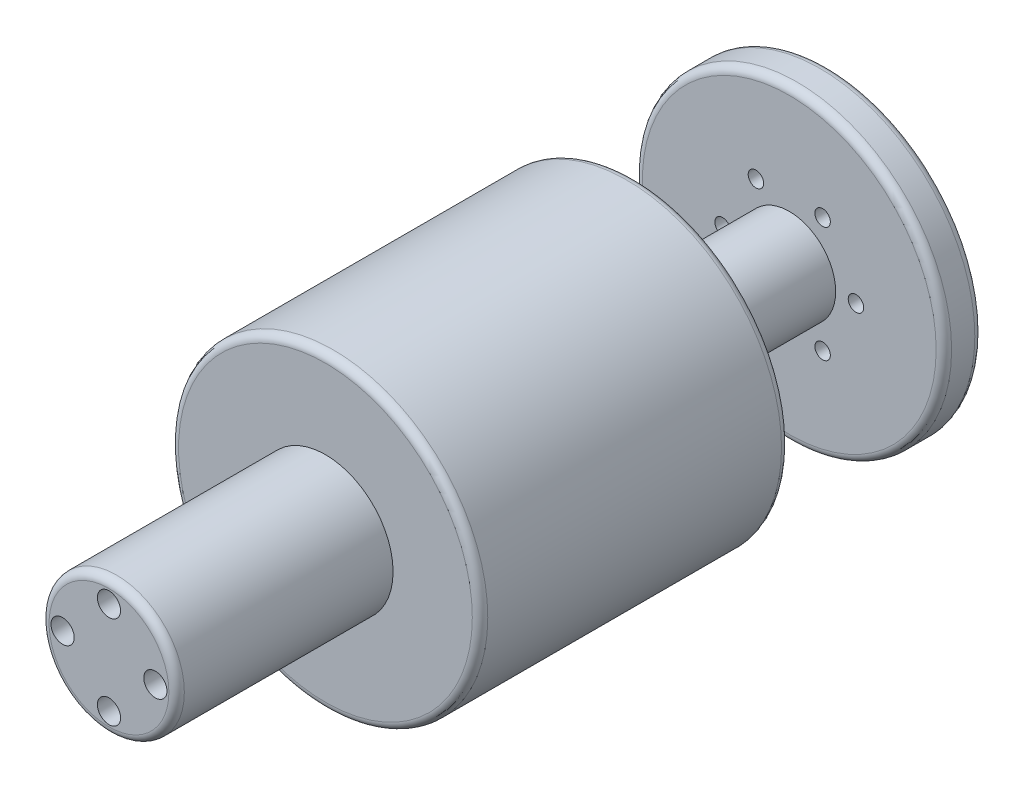
ISO-10303-21;
HEADER;
FILE_DESCRIPTION(('STEP AP214'),'2;1');
FILE_NAME('part.step','',(''),(''),'','','');
FILE_SCHEMA(('AUTOMOTIVE_DESIGN { 1 0 10303 214 1 1 1 1 }'));
ENDSEC;
DATA;
#1=APPLICATION_CONTEXT('core data for automotive mechanical design processes');
#2=APPLICATION_PROTOCOL_DEFINITION('international standard','automotive_design',2000,#1);
#3=PRODUCT_CONTEXT('',#1,'mechanical');
#4=PRODUCT('Part','Part','',(#3));
#5=PRODUCT_RELATED_PRODUCT_CATEGORY('part','',(#4));
#6=PRODUCT_DEFINITION_FORMATION('','',#4);
#7=PRODUCT_DEFINITION_CONTEXT('part definition',#1,'design');
#8=PRODUCT_DEFINITION('design','',#6,#7);
#9=PRODUCT_DEFINITION_SHAPE('','',#8);
#10=(LENGTH_UNIT() NAMED_UNIT(*) SI_UNIT(.MILLI.,.METRE.));
#11=(NAMED_UNIT(*) PLANE_ANGLE_UNIT() SI_UNIT($,.RADIAN.));
#12=(NAMED_UNIT(*) SI_UNIT($,.STERADIAN.) SOLID_ANGLE_UNIT());
#13=UNCERTAINTY_MEASURE_WITH_UNIT(LENGTH_MEASURE(1.E-05),#10,'distance_accuracy_value','');
#14=(GEOMETRIC_REPRESENTATION_CONTEXT(3) GLOBAL_UNCERTAINTY_ASSIGNED_CONTEXT((#13)) GLOBAL_UNIT_ASSIGNED_CONTEXT((#10,
#11,#12)) REPRESENTATION_CONTEXT('',''));
#15=CARTESIAN_POINT('',(0.,0.,0.));
#16=DIRECTION('',(0.,0.,1.));
#17=DIRECTION('',(1.,0.,0.));
#18=AXIS2_PLACEMENT_3D('',#15,#16,#17);
#19=CARTESIAN_POINT('',(8.62499999999986,-14.9389382152817,10.));
#20=DIRECTION('',(0.,0.,-1.));
#21=DIRECTION('',(-1.,0.,0.));
#22=AXIS2_PLACEMENT_3D('',#19,#20,#21);
#23=CYLINDRICAL_SURFACE('',#22,2.);
#24=CARTESIAN_POINT('',(8.62499999999986,-14.9389382152817,10.));
#25=DIRECTION('',(0.,0.,1.));
#26=DIRECTION('',(1.,0.,0.));
#27=AXIS2_PLACEMENT_3D('',#24,#25,#26);
#28=CIRCLE('',#27,2.);
#29=CARTESIAN_POINT('',(10.6249999999999,-14.9389382152817,10.));
#30=VERTEX_POINT('',#29);
#31=EDGE_CURVE('E148',#30,#30,#28,.T.);
#32=ORIENTED_EDGE('',*,*,#31,.T.);
#33=EDGE_LOOP('',(#32));
#34=FACE_BOUND('',#33,.T.);
#35=CARTESIAN_POINT('',(8.62499999999986,-14.9389382152817,0.));
#36=DIRECTION('',(0.,0.,1.));
#37=DIRECTION('',(1.,0.,0.));
#38=AXIS2_PLACEMENT_3D('',#35,#36,#37);
#39=CIRCLE('',#38,2.);
#40=CARTESIAN_POINT('',(10.6249999999999,-14.9389382152817,0.));
#41=VERTEX_POINT('',#40);
#42=EDGE_CURVE('E128',#41,#41,#39,.T.);
#43=ORIENTED_EDGE('',*,*,#42,.F.);
#44=EDGE_LOOP('',(#43));
#45=FACE_BOUND('',#44,.T.);
#46=ADVANCED_FACE('F39',(#34,#45),#23,.F.);
#47=CARTESIAN_POINT('',(17.25,-1.20456106190088E-13,10.));
#48=DIRECTION('',(0.,0.,-1.));
#49=DIRECTION('',(-1.,0.,0.));
#50=AXIS2_PLACEMENT_3D('',#47,#48,#49);
#51=CYLINDRICAL_SURFACE('',#50,2.);
#52=CARTESIAN_POINT('',(17.25,-1.20456106190088E-13,10.));
#53=DIRECTION('',(0.,0.,1.));
#54=DIRECTION('',(1.,0.,0.));
#55=AXIS2_PLACEMENT_3D('',#52,#53,#54);
#56=CIRCLE('',#55,2.);
#57=CARTESIAN_POINT('',(19.25,-1.20456106190088E-13,10.));
#58=VERTEX_POINT('',#57);
#59=EDGE_CURVE('E151',#58,#58,#56,.T.);
#60=ORIENTED_EDGE('',*,*,#59,.T.);
#61=EDGE_LOOP('',(#60));
#62=FACE_BOUND('',#61,.T.);
#63=CARTESIAN_POINT('',(17.25,-1.20456106190088E-13,0.));
#64=DIRECTION('',(0.,0.,1.));
#65=DIRECTION('',(1.,0.,0.));
#66=AXIS2_PLACEMENT_3D('',#63,#64,#65);
#67=CIRCLE('',#66,2.);
#68=CARTESIAN_POINT('',(19.25,-1.20456106190088E-13,0.));
#69=VERTEX_POINT('',#68);
#70=EDGE_CURVE('E132',#69,#69,#67,.T.);
#71=ORIENTED_EDGE('',*,*,#70,.F.);
#72=EDGE_LOOP('',(#71));
#73=FACE_BOUND('',#72,.T.);
#74=ADVANCED_FACE('F235',(#62,#73),#51,.F.);
#75=CARTESIAN_POINT('',(8.62500000000007,14.9389382152815,10.));
#76=DIRECTION('',(0.,0.,-1.));
#77=DIRECTION('',(-1.,0.,0.));
#78=AXIS2_PLACEMENT_3D('',#75,#76,#77);
#79=CYLINDRICAL_SURFACE('',#78,2.);
#80=CARTESIAN_POINT('',(8.62500000000007,14.9389382152815,10.));
#81=DIRECTION('',(0.,0.,1.));
#82=DIRECTION('',(1.,0.,0.));
#83=AXIS2_PLACEMENT_3D('',#80,#81,#82);
#84=CIRCLE('',#83,2.);
#85=CARTESIAN_POINT('',(10.6250000000001,14.9389382152815,10.));
#86=VERTEX_POINT('',#85);
#87=EDGE_CURVE('E154',#86,#86,#84,.T.);
#88=ORIENTED_EDGE('',*,*,#87,.T.);
#89=EDGE_LOOP('',(#88));
#90=FACE_BOUND('',#89,.T.);
#91=CARTESIAN_POINT('',(8.62500000000007,14.9389382152815,0.));
#92=DIRECTION('',(0.,0.,1.));
#93=DIRECTION('',(1.,0.,0.));
#94=AXIS2_PLACEMENT_3D('',#91,#92,#93);
#95=CIRCLE('',#94,2.);
#96=CARTESIAN_POINT('',(10.6250000000001,14.9389382152815,0.));
#97=VERTEX_POINT('',#96);
#98=EDGE_CURVE('E135',#97,#97,#95,.T.);
#99=ORIENTED_EDGE('',*,*,#98,.F.);
#100=EDGE_LOOP('',(#99));
#101=FACE_BOUND('',#100,.T.);
#102=ADVANCED_FACE('F241',(#90,#101),#79,.F.);
#103=CARTESIAN_POINT('',(-8.62499999999997,14.9389382152816,10.));
#104=DIRECTION('',(0.,0.,-1.));
#105=DIRECTION('',(-1.,0.,0.));
#106=AXIS2_PLACEMENT_3D('',#103,#104,#105);
#107=CYLINDRICAL_SURFACE('',#106,2.);
#108=CARTESIAN_POINT('',(-8.62499999999997,14.9389382152816,10.));
#109=DIRECTION('',(0.,0.,1.));
#110=DIRECTION('',(1.,0.,0.));
#111=AXIS2_PLACEMENT_3D('',#108,#109,#110);
#112=CIRCLE('',#111,2.);
#113=CARTESIAN_POINT('',(-6.62499999999997,14.9389382152816,10.));
#114=VERTEX_POINT('',#113);
#115=EDGE_CURVE('E157',#114,#114,#112,.T.);
#116=ORIENTED_EDGE('',*,*,#115,.T.);
#117=EDGE_LOOP('',(#116));
#118=FACE_BOUND('',#117,.T.);
#119=CARTESIAN_POINT('',(-8.62499999999997,14.9389382152816,0.));
#120=DIRECTION('',(0.,0.,1.));
#121=DIRECTION('',(1.,0.,0.));
#122=AXIS2_PLACEMENT_3D('',#119,#120,#121);
#123=CIRCLE('',#122,2.);
#124=CARTESIAN_POINT('',(-6.62499999999997,14.9389382152816,0.));
#125=VERTEX_POINT('',#124);
#126=EDGE_CURVE('E138',#125,#125,#123,.T.);
#127=ORIENTED_EDGE('',*,*,#126,.F.);
#128=EDGE_LOOP('',(#127));
#129=FACE_BOUND('',#128,.T.);
#130=ADVANCED_FACE('F251',(#118,#129),#107,.F.);
#131=CARTESIAN_POINT('',(-17.25,0.,10.));
#132=DIRECTION('',(0.,0.,-1.));
#133=DIRECTION('',(-1.,0.,0.));
#134=AXIS2_PLACEMENT_3D('',#131,#132,#133);
#135=CYLINDRICAL_SURFACE('',#134,2.);
#136=CARTESIAN_POINT('',(-17.25,0.,10.));
#137=DIRECTION('',(0.,0.,1.));
#138=DIRECTION('',(1.,0.,0.));
#139=AXIS2_PLACEMENT_3D('',#136,#137,#138);
#140=CIRCLE('',#139,2.);
#141=CARTESIAN_POINT('',(-15.25,0.,10.));
#142=VERTEX_POINT('',#141);
#143=EDGE_CURVE('E160',#142,#142,#140,.T.);
#144=ORIENTED_EDGE('',*,*,#143,.T.);
#145=EDGE_LOOP('',(#144));
#146=FACE_BOUND('',#145,.T.);
#147=CARTESIAN_POINT('',(-17.25,0.,0.));
#148=DIRECTION('',(0.,0.,1.));
#149=DIRECTION('',(1.,0.,0.));
#150=AXIS2_PLACEMENT_3D('',#147,#148,#149);
#151=CIRCLE('',#150,2.);
#152=CARTESIAN_POINT('',(-15.25,0.,0.));
#153=VERTEX_POINT('',#152);
#154=EDGE_CURVE('E141',#153,#153,#151,.T.);
#155=ORIENTED_EDGE('',*,*,#154,.F.);
#156=EDGE_LOOP('',(#155));
#157=FACE_BOUND('',#156,.T.);
#158=ADVANCED_FACE('F255',(#146,#157),#135,.F.);
#159=CARTESIAN_POINT('',(-8.62500000000017,-14.9389382152815,10.));
#160=DIRECTION('',(0.,0.,-1.));
#161=DIRECTION('',(-1.,0.,0.));
#162=AXIS2_PLACEMENT_3D('',#159,#160,#161);
#163=CYLINDRICAL_SURFACE('',#162,2.);
#164=CARTESIAN_POINT('',(-8.62500000000017,-14.9389382152815,10.));
#165=DIRECTION('',(0.,0.,1.));
#166=DIRECTION('',(1.,0.,0.));
#167=AXIS2_PLACEMENT_3D('',#164,#165,#166);
#168=CIRCLE('',#167,2.);
#169=CARTESIAN_POINT('',(-6.62500000000017,-14.9389382152815,10.));
#170=VERTEX_POINT('',#169);
#171=EDGE_CURVE('E131',#170,#170,#168,.T.);
#172=ORIENTED_EDGE('',*,*,#171,.T.);
#173=EDGE_LOOP('',(#172));
#174=FACE_BOUND('',#173,.T.);
#175=CARTESIAN_POINT('',(-8.62500000000017,-14.9389382152815,0.));
#176=DIRECTION('',(0.,0.,1.));
#177=DIRECTION('',(1.,0.,0.));
#178=AXIS2_PLACEMENT_3D('',#175,#176,#177);
#179=CIRCLE('',#178,2.);
#180=CARTESIAN_POINT('',(-6.62500000000017,-14.9389382152815,0.));
#181=VERTEX_POINT('',#180);
#182=EDGE_CURVE('E144',#181,#181,#179,.T.);
#183=ORIENTED_EDGE('',*,*,#182,.F.);
#184=EDGE_LOOP('',(#183));
#185=FACE_BOUND('',#184,.T.);
#186=ADVANCED_FACE('F259',(#174,#185),#163,.F.);
#187=CARTESIAN_POINT('',(0.,0.,10.));
#188=DIRECTION('',(0.,0.,-1.));
#189=DIRECTION('',(-1.,0.,0.));
#190=AXIS2_PLACEMENT_3D('',#187,#188,#189);
#191=CYLINDRICAL_SURFACE('',#190,40.);
#192=CARTESIAN_POINT('',(0.,0.,8.));
#193=DIRECTION('',(0.,0.,1.));
#194=DIRECTION('',(1.,0.,0.));
#195=AXIS2_PLACEMENT_3D('',#192,#193,#194);
#196=CIRCLE('',#195,40.);
#197=CARTESIAN_POINT('',(40.,0.,8.));
#198=VERTEX_POINT('',#197);
#199=EDGE_CURVE('E46',#198,#198,#196,.F.);
#200=ORIENTED_EDGE('',*,*,#199,.T.);
#201=EDGE_LOOP('',(#200));
#202=FACE_BOUND('',#201,.T.);
#203=CARTESIAN_POINT('',(0.,0.,2.));
#204=DIRECTION('',(0.,0.,1.));
#205=DIRECTION('',(1.,0.,0.));
#206=AXIS2_PLACEMENT_3D('',#203,#204,#205);
#207=CIRCLE('',#206,40.);
#208=CARTESIAN_POINT('',(40.,0.,2.));
#209=VERTEX_POINT('',#208);
#210=EDGE_CURVE('E50',#209,#209,#207,.T.);
#211=ORIENTED_EDGE('',*,*,#210,.T.);
#212=EDGE_LOOP('',(#211));
#213=FACE_BOUND('',#212,.T.);
#214=ADVANCED_FACE('F246',(#202,#213),#191,.T.);
#215=CARTESIAN_POINT('',(0.,0.,10.));
#216=DIRECTION('',(0.,0.,1.));
#217=DIRECTION('',(1.,0.,0.));
#218=AXIS2_PLACEMENT_3D('',#215,#216,#217);
#219=PLANE('',#218);
#220=CARTESIAN_POINT('',(0.,0.,10.));
#221=DIRECTION('',(0.,0.,1.));
#222=DIRECTION('',(1.,0.,0.));
#223=AXIS2_PLACEMENT_3D('',#220,#221,#222);
#224=CIRCLE('',#223,38.);
#225=CARTESIAN_POINT('',(38.,0.,10.));
#226=VERTEX_POINT('',#225);
#227=EDGE_CURVE('E54',#226,#226,#224,.T.);
#228=ORIENTED_EDGE('',*,*,#227,.T.);
#229=EDGE_LOOP('',(#228));
#230=FACE_BOUND('',#229,.T.);
#231=CARTESIAN_POINT('',(0.,0.,10.));
#232=DIRECTION('',(0.,0.,1.));
#233=DIRECTION('',(1.,0.,0.));
#234=AXIS2_PLACEMENT_3D('',#231,#232,#233);
#235=CIRCLE('',#234,12.);
#236=CARTESIAN_POINT('',(12.,0.,10.));
#237=VERTEX_POINT('',#236);
#238=EDGE_CURVE('E86',#237,#237,#235,.T.);
#239=ORIENTED_EDGE('',*,*,#238,.F.);
#240=EDGE_LOOP('',(#239));
#241=FACE_BOUND('',#240,.T.);
#242=ORIENTED_EDGE('',*,*,#171,.F.);
#243=EDGE_LOOP('',(#242));
#244=FACE_BOUND('',#243,.T.);
#245=ORIENTED_EDGE('',*,*,#143,.F.);
#246=EDGE_LOOP('',(#245));
#247=FACE_BOUND('',#246,.T.);
#248=ORIENTED_EDGE('',*,*,#115,.F.);
#249=EDGE_LOOP('',(#248));
#250=FACE_BOUND('',#249,.T.);
#251=ORIENTED_EDGE('',*,*,#87,.F.);
#252=EDGE_LOOP('',(#251));
#253=FACE_BOUND('',#252,.T.);
#254=ORIENTED_EDGE('',*,*,#59,.F.);
#255=EDGE_LOOP('',(#254));
#256=FACE_BOUND('',#255,.T.);
#257=ORIENTED_EDGE('',*,*,#31,.F.);
#258=EDGE_LOOP('',(#257));
#259=FACE_BOUND('',#258,.T.);
#260=ADVANCED_FACE('F285',(#230,#241,#244,#247,#250,#253,#256,#259),#219,.T.);
#261=CARTESIAN_POINT('',(0.,0.,0.));
#262=DIRECTION('',(0.,0.,1.));
#263=DIRECTION('',(1.,0.,0.));
#264=AXIS2_PLACEMENT_3D('',#261,#262,#263);
#265=PLANE('',#264);
#266=CARTESIAN_POINT('',(0.,0.,0.));
#267=DIRECTION('',(0.,0.,1.));
#268=DIRECTION('',(1.,0.,0.));
#269=AXIS2_PLACEMENT_3D('',#266,#267,#268);
#270=CIRCLE('',#269,38.);
#271=CARTESIAN_POINT('',(38.,0.,0.));
#272=VERTEX_POINT('',#271);
#273=EDGE_CURVE('E10',#272,#272,#270,.F.);
#274=ORIENTED_EDGE('',*,*,#273,.T.);
#275=EDGE_LOOP('',(#274));
#276=FACE_BOUND('',#275,.T.);
#277=ORIENTED_EDGE('',*,*,#182,.T.);
#278=EDGE_LOOP('',(#277));
#279=FACE_BOUND('',#278,.T.);
#280=ORIENTED_EDGE('',*,*,#154,.T.);
#281=EDGE_LOOP('',(#280));
#282=FACE_BOUND('',#281,.T.);
#283=ORIENTED_EDGE('',*,*,#126,.T.);
#284=EDGE_LOOP('',(#283));
#285=FACE_BOUND('',#284,.T.);
#286=ORIENTED_EDGE('',*,*,#98,.T.);
#287=EDGE_LOOP('',(#286));
#288=FACE_BOUND('',#287,.T.);
#289=ORIENTED_EDGE('',*,*,#70,.T.);
#290=EDGE_LOOP('',(#289));
#291=FACE_BOUND('',#290,.T.);
#292=ORIENTED_EDGE('',*,*,#42,.T.);
#293=EDGE_LOOP('',(#292));
#294=FACE_BOUND('',#293,.T.);
#295=ADVANCED_FACE('F288',(#276,#279,#282,#285,#288,#291,#294),#265,.F.);
#296=CARTESIAN_POINT('',(0.,0.,50.));
#297=DIRECTION('',(0.,0.,-1.));
#298=DIRECTION('',(-1.,0.,0.));
#299=AXIS2_PLACEMENT_3D('',#296,#297,#298);
#300=CYLINDRICAL_SURFACE('',#299,12.);
#301=CARTESIAN_POINT('',(0.,0.,50.));
#302=DIRECTION('',(0.,0.,1.));
#303=DIRECTION('',(1.,0.,0.));
#304=AXIS2_PLACEMENT_3D('',#301,#302,#303);
#305=CIRCLE('',#304,12.);
#306=CARTESIAN_POINT('',(12.,0.,50.));
#307=VERTEX_POINT('',#306);
#308=EDGE_CURVE('E147',#307,#307,#305,.T.);
#309=ORIENTED_EDGE('',*,*,#308,.F.);
#310=EDGE_LOOP('',(#309));
#311=FACE_BOUND('',#310,.T.);
#312=ORIENTED_EDGE('',*,*,#238,.T.);
#313=EDGE_LOOP('',(#312));
#314=FACE_BOUND('',#313,.T.);
#315=ADVANCED_FACE('F308',(#311,#314),#300,.T.);
#316=CARTESIAN_POINT('',(0.,0.,130.));
#317=DIRECTION('',(0.,0.,-1.));
#318=DIRECTION('',(-1.,0.,0.));
#319=AXIS2_PLACEMENT_3D('',#316,#317,#318);
#320=CYLINDRICAL_SURFACE('',#319,40.);
#321=CARTESIAN_POINT('',(0.,0.,128.));
#322=DIRECTION('',(0.,0.,1.));
#323=DIRECTION('',(1.,0.,0.));
#324=AXIS2_PLACEMENT_3D('',#321,#322,#323);
#325=CIRCLE('',#324,40.);
#326=CARTESIAN_POINT('',(40.,0.,128.));
#327=VERTEX_POINT('',#326);
#328=EDGE_CURVE('E62',#327,#327,#325,.F.);
#329=ORIENTED_EDGE('',*,*,#328,.T.);
#330=EDGE_LOOP('',(#329));
#331=FACE_BOUND('',#330,.T.);
#332=CARTESIAN_POINT('',(0.,0.,52.));
#333=DIRECTION('',(0.,0.,1.));
#334=DIRECTION('',(1.,0.,0.));
#335=AXIS2_PLACEMENT_3D('',#332,#333,#334);
#336=CIRCLE('',#335,40.);
#337=CARTESIAN_POINT('',(40.,0.,52.));
#338=VERTEX_POINT('',#337);
#339=EDGE_CURVE('E65',#338,#338,#336,.T.);
#340=ORIENTED_EDGE('',*,*,#339,.T.);
#341=EDGE_LOOP('',(#340));
#342=FACE_BOUND('',#341,.T.);
#343=CARTESIAN_POINT('',(2.08264233531441E-13,-40.,113.));
#344=CARTESIAN_POINT('',(0.168257619023096,-39.9999985165458,112.999992626366));
#345=CARTESIAN_POINT('',(0.336631202048384,-39.9989270181516,112.985797093119));
#346=CARTESIAN_POINT('',(0.668723883943286,-39.9947556157596,112.929375030913));
#347=CARTESIAN_POINT('',(0.832437422326198,-39.9916533864778,112.887116367526));
#348=CARTESIAN_POINT('',(1.15035193191985,-39.9837712537186,112.775793343761));
#349=CARTESIAN_POINT('',(1.30455807387039,-39.9789922718022,112.706743705783));
#350=CARTESIAN_POINT('',(1.59915296135625,-39.9682932494129,112.543824094273));
#351=CARTESIAN_POINT('',(1.73954474359991,-39.9623734605654,112.449959592408));
#352=CARTESIAN_POINT('',(2.0028579150653,-39.950043737978,112.239861558925));
#353=CARTESIAN_POINT('',(2.12574645943725,-39.9436329165819,112.123586911832));
#354=CARTESIAN_POINT('',(2.35028330739585,-39.9310511676876,111.87205540531));
#355=CARTESIAN_POINT('',(2.45193069808554,-39.9248802505092,111.736797730452));
#356=CARTESIAN_POINT('',(2.63120767749553,-39.9134670791954,111.450945090381));
#357=CARTESIAN_POINT('',(2.70880893620685,-39.908225923544,111.30033230994));
#358=CARTESIAN_POINT('',(2.83760978093586,-39.8992752242033,110.988169255312));
#359=CARTESIAN_POINT('',(2.88880975377396,-39.895565658074,110.826619141415));
#360=CARTESIAN_POINT('',(2.96326075315877,-39.8901051778004,110.497492215199));
#361=CARTESIAN_POINT('',(2.98656462088455,-39.8883505610028,110.329927418385));
#362=CARTESIAN_POINT('',(3.00472509149697,-39.8869867785079,109.993256093479));
#363=CARTESIAN_POINT('',(2.99958213621736,-39.8873775794881,109.824149589373));
#364=CARTESIAN_POINT('',(2.96103868835158,-39.8902571273862,109.489556377892));
#365=CARTESIAN_POINT('',(2.92769551352809,-39.8927416187807,109.324063026072));
#366=CARTESIAN_POINT('',(2.83378710453861,-39.8995219039608,109.001028605769));
#367=CARTESIAN_POINT('',(2.77322164894693,-39.9038177124796,108.843487601982));
#368=CARTESIAN_POINT('',(2.62652334379423,-39.9137414707227,108.540646567522));
#369=CARTESIAN_POINT('',(2.54036465453014,-39.9193707656063,108.395359099646));
#370=CARTESIAN_POINT('',(2.34494427486868,-39.9313258919028,108.12128667427));
#371=CARTESIAN_POINT('',(2.23568220685775,-39.9376517346997,107.992501986555));
#372=CARTESIAN_POINT('',(1.99683455686476,-39.9503060672294,107.754757483513));
#373=CARTESIAN_POINT('',(1.86719940035284,-39.9566345248459,107.645847464811));
#374=CARTESIAN_POINT('',(1.59145875186909,-39.9685660304198,107.451328472869));
#375=CARTESIAN_POINT('',(1.44535325143739,-39.9741690780047,107.365719511597));
#376=CARTESIAN_POINT('',(1.14078788043288,-39.9840192083857,107.220236339512));
#377=CARTESIAN_POINT('',(0.982327018858166,-39.9882661822741,107.160364195517));
#378=CARTESIAN_POINT('',(0.657563305549295,-39.9949243000265,107.06808837559));
#379=CARTESIAN_POINT('',(0.491260585685355,-39.99733547475,107.035684237925));
#380=CARTESIAN_POINT('',(0.155965687567709,-40.0000463470773,106.999326380922));
#381=CARTESIAN_POINT('',(-0.0130189896504348,-40.0003511515157,106.995303850692));
#382=CARTESIAN_POINT('',(-0.349260461985921,-39.9988285542728,107.015643336139));
#383=CARTESIAN_POINT('',(-0.516517270108989,-39.9970011686525,107.040005138011));
#384=CARTESIAN_POINT('',(-0.844360022352803,-39.9914230750648,107.116364737621));
#385=CARTESIAN_POINT('',(-1.00495340329193,-39.9876745772022,107.168330781117));
#386=CARTESIAN_POINT('',(-1.31514065476785,-39.9786756181681,107.298391387273));
#387=CARTESIAN_POINT('',(-1.46473438359859,-39.9734251376511,107.376486286474));
#388=CARTESIAN_POINT('',(-1.74898991875331,-39.9619986511672,107.556761675796));
#389=CARTESIAN_POINT('',(-1.88362264051089,-39.9558208954995,107.658987913438));
#390=CARTESIAN_POINT('',(-2.13384119203383,-39.9432403278502,107.884557850938));
#391=CARTESIAN_POINT('',(-2.24942675346941,-39.9368375126997,108.007901848247));
#392=CARTESIAN_POINT('',(-2.45850469958288,-39.9245134751873,108.272503880264));
#393=CARTESIAN_POINT('',(-2.55195229417511,-39.9185932448018,108.413797358866));
#394=CARTESIAN_POINT('',(-2.71379488945196,-39.9079180570866,108.710110396763));
#395=CARTESIAN_POINT('',(-2.78219009917357,-39.903163090034,108.865129841516));
#396=CARTESIAN_POINT('',(-2.89190958476895,-39.8953619134742,109.184333614975));
#397=CARTESIAN_POINT('',(-2.93326161345801,-39.8923139526305,109.348508359705));
#398=CARTESIAN_POINT('',(-2.98781138678334,-39.8882657304882,109.681494462031));
#399=CARTESIAN_POINT('',(-3.00100955814756,-39.887265438153,109.850305749311));
#400=CARTESIAN_POINT('',(-2.99887243106289,-39.8874261383252,110.187327826495));
#401=CARTESIAN_POINT('',(-2.98360752171426,-39.8885817991714,110.355539069792));
#402=CARTESIAN_POINT('',(-2.92512396386774,-39.892912873915,110.68700216742));
#403=CARTESIAN_POINT('',(-2.88190526886748,-39.8960882911723,110.8502540135));
#404=CARTESIAN_POINT('',(-2.76875800547031,-39.904099707112,111.167171216844));
#405=CARTESIAN_POINT('',(-2.69883031681887,-39.908935651099,111.320836889665));
#406=CARTESIAN_POINT('',(-2.53425849239345,-39.9197232475816,111.614257915429));
#407=CARTESIAN_POINT('',(-2.43961485361995,-39.9256748776417,111.754013548004));
#408=CARTESIAN_POINT('',(-2.22803417893434,-39.9380406158325,112.016006699942));
#409=CARTESIAN_POINT('',(-2.11104537639981,-39.9444557759261,112.13820236328));
#410=CARTESIAN_POINT('',(-1.85818194690522,-39.9570162658315,112.361268100622));
#411=CARTESIAN_POINT('',(-1.72230273559116,-39.9631615296667,112.462132983012));
#412=CARTESIAN_POINT('',(-1.43530083320746,-39.9744988045533,112.639782325078));
#413=CARTESIAN_POINT('',(-1.28415429653468,-39.9796892875503,112.716528320982));
#414=CARTESIAN_POINT('',(-0.971187835830208,-39.9885133439152,112.843456568881));
#415=CARTESIAN_POINT('',(-0.809380527475121,-39.9921487206811,112.893669606136));
#416=CARTESIAN_POINT('',(-0.538835833448528,-39.9965112401159,112.953203977054));
#417=CARTESIAN_POINT('',(-0.431842385875876,-39.9978136309276,112.970729437579));
#418=CARTESIAN_POINT('',(-0.21658197589577,-39.9995584874585,112.994129810305));
#419=CARTESIAN_POINT('',(-0.108315016137928,-40.0000009549664,113.000004746741));
#420=CARTESIAN_POINT('',(2.08264233531441E-13,-40.,113.));
#421=B_SPLINE_CURVE_WITH_KNOTS('',3,(#343,#344,#345,#346,#347,#348,#349,#350,#351,#352,#353,
#354,#355,#356,#357,#358,#359,#360,#361,#362,#363,#364,#365,#366,#367,#368,#369,#370,#371,#372,
#373,#374,#375,#376,#377,#378,#379,#380,#381,#382,#383,#384,#385,#386,#387,#388,#389,#390,#391,
#392,#393,#394,#395,#396,#397,#398,#399,#400,#401,#402,#403,#404,#405,#406,#407,#408,#409,#410,
#411,#412,#413,#414,#415,#416,#417,#418,#419,#420),.UNSPECIFIED.,.T.,.F.,(4,2,2,2,2,2,2,2,2,2,2,
2,2,2,2,2,2,2,2,2,2,2,2,2,2,2,2,2,2,2,2,2,2,2,2,2,2,2,4),(0.,0.504377412682809,1.00933337423215,
1.51401224027407,2.01857991749138,2.5240822826688,3.02960636873346,3.53572379442509,
4.04183380448849,4.54698360940744,5.05212556840275,5.5562432723286,6.0603650768158,
6.56499759796794,7.06963836773243,7.57552667274627,8.08141523760734,8.58734442072854,
9.09326509907796,9.59795875553064,10.1026486103661,10.6067591539046,11.1108761906485,
11.6159567042388,12.1210443326201,12.6271453023128,13.1332420490051,13.6388186001384,
14.1443874881947,14.6487077640481,15.1530288788631,15.657333383694,16.1616277485024,
16.6671048925629,17.1727049214422,17.6791072154342,18.1849206512445,18.5096118096951,
18.8343022927277),.UNSPECIFIED.);
#422=CARTESIAN_POINT('',(2.08264233531441E-13,-40.,113.));
#423=VERTEX_POINT('',#422);
#424=EDGE_CURVE('E78',#423,#423,#421,.T.);
#425=ORIENTED_EDGE('',*,*,#424,.T.);
#426=EDGE_LOOP('',(#425));
#427=FACE_BOUND('',#426,.T.);
#428=CARTESIAN_POINT('',(0.,-40.,73.));
#429=CARTESIAN_POINT('',(0.168257619022819,-39.9999985165458,72.999992626366));
#430=CARTESIAN_POINT('',(0.336631202048108,-39.9989270181516,72.9857970931188));
#431=CARTESIAN_POINT('',(0.668723883943009,-39.9947556157596,72.9293750309134));
#432=CARTESIAN_POINT('',(0.83243742232592,-39.9916533864778,72.887116367526));
#433=CARTESIAN_POINT('',(1.15035193191957,-39.9837712537186,72.7757933437605));
#434=CARTESIAN_POINT('',(1.30455807387012,-39.9789922718022,72.706743705783));
#435=CARTESIAN_POINT('',(1.59915296135597,-39.9682932494129,72.5438240942725));
#436=CARTESIAN_POINT('',(1.73954474359963,-39.9623734605654,72.4499595924081));
#437=CARTESIAN_POINT('',(2.00285791506503,-39.9500437379781,72.239861558925));
#438=CARTESIAN_POINT('',(2.12574645943698,-39.943632916582,72.1235869118315));
#439=CARTESIAN_POINT('',(2.35028330739558,-39.9310511676876,71.8720554053101));
#440=CARTESIAN_POINT('',(2.45193069808526,-39.9248802505092,71.7367977304518));
#441=CARTESIAN_POINT('',(2.63120767749525,-39.9134670791955,71.4509450903812));
#442=CARTESIAN_POINT('',(2.70880893620658,-39.908225923544,71.3003323099398));
#443=CARTESIAN_POINT('',(2.83760978093558,-39.8992752242033,70.9881692553124));
#444=CARTESIAN_POINT('',(2.88880975377369,-39.895565658074,70.8266191414148));
#445=CARTESIAN_POINT('',(2.9632607531585,-39.8901051778004,70.4974922151989));
#446=CARTESIAN_POINT('',(2.98656462088427,-39.8883505610028,70.3299274183847));
#447=CARTESIAN_POINT('',(3.0047250914967,-39.8869867785079,69.9932560934786));
#448=CARTESIAN_POINT('',(2.99958213621708,-39.8873775794881,69.824149589373));
#449=CARTESIAN_POINT('',(2.9610386883513,-39.8902571273862,69.4895563778922));
#450=CARTESIAN_POINT('',(2.92769551352782,-39.8927416187808,69.3240630260717));
#451=CARTESIAN_POINT('',(2.83378710453834,-39.8995219039609,69.0010286057688));
#452=CARTESIAN_POINT('',(2.77322164894665,-39.9038177124796,68.8434876019825));
#453=CARTESIAN_POINT('',(2.62652334379396,-39.9137414707227,68.5406465675223));
#454=CARTESIAN_POINT('',(2.54036465452986,-39.9193707656063,68.3953590996464));
#455=CARTESIAN_POINT('',(2.3449442748684,-39.9313258919028,68.1212866742703));
#456=CARTESIAN_POINT('',(2.23568220685747,-39.9376517346997,67.9925019865553));
#457=CARTESIAN_POINT('',(1.99683455686448,-39.9503060672294,67.7547574835128));
#458=CARTESIAN_POINT('',(1.86719940035256,-39.9566345248459,67.6458474648105));
#459=CARTESIAN_POINT('',(1.59145875186882,-39.9685660304199,67.4513284728686));
#460=CARTESIAN_POINT('',(1.44535325143712,-39.9741690780047,67.3657195115974));
#461=CARTESIAN_POINT('',(1.1407878804326,-39.9840192083857,67.2202363395125));
#462=CARTESIAN_POINT('',(0.98232701885789,-39.9882661822741,67.1603641955174));
#463=CARTESIAN_POINT('',(0.657563305549019,-39.9949243000265,67.0680883755903));
#464=CARTESIAN_POINT('',(0.491260585685078,-39.99733547475,67.0356842379247));
#465=CARTESIAN_POINT('',(0.155965687567432,-40.0000463470773,66.9993263809221));
#466=CARTESIAN_POINT('',(-0.0130189896507115,-40.0003511515157,66.9953038506916));
#467=CARTESIAN_POINT('',(-0.349260461986197,-39.9988285542728,67.0156433361394));
#468=CARTESIAN_POINT('',(-0.516517270109266,-39.9970011686525,67.0400051380106));
#469=CARTESIAN_POINT('',(-0.844360022353079,-39.9914230750648,67.1163647376211));
#470=CARTESIAN_POINT('',(-1.00495340329221,-39.9876745772022,67.1683307811173));
#471=CARTESIAN_POINT('',(-1.31514065476813,-39.9786756181681,67.2983913872734));
#472=CARTESIAN_POINT('',(-1.46473438359886,-39.9734251376511,67.3764862864736));
#473=CARTESIAN_POINT('',(-1.74898991875359,-39.9619986511672,67.5567616757957));
#474=CARTESIAN_POINT('',(-1.88362264051117,-39.9558208954994,67.6589879134377));
#475=CARTESIAN_POINT('',(-2.13384119203411,-39.9432403278502,67.8845578509382));
#476=CARTESIAN_POINT('',(-2.24942675346968,-39.9368375126997,68.0079018482465));
#477=CARTESIAN_POINT('',(-2.45850469958316,-39.9245134751873,68.2725038802643));
#478=CARTESIAN_POINT('',(-2.55195229417539,-39.9185932448018,68.413797358866));
#479=CARTESIAN_POINT('',(-2.71379488945224,-39.9079180570866,68.7101103967631));
#480=CARTESIAN_POINT('',(-2.78219009917385,-39.903163090034,68.8651298415157));
#481=CARTESIAN_POINT('',(-2.89190958476923,-39.8953619134741,69.1843336149746));
#482=CARTESIAN_POINT('',(-2.93326161345829,-39.8923139526305,69.3485083597054));
#483=CARTESIAN_POINT('',(-2.98781138678361,-39.8882657304882,69.6814944620315));
#484=CARTESIAN_POINT('',(-3.00100955814783,-39.887265438153,69.8503057493113));
#485=CARTESIAN_POINT('',(-2.99887243106317,-39.8874261383252,70.1873278264948));
#486=CARTESIAN_POINT('',(-2.98360752171454,-39.8885817991714,70.3555390697923));
#487=CARTESIAN_POINT('',(-2.92512396386802,-39.892912873915,70.68700216742));
#488=CARTESIAN_POINT('',(-2.88190526886776,-39.8960882911723,70.8502540134996));
#489=CARTESIAN_POINT('',(-2.76875800547059,-39.9040997071119,71.1671712168436));
#490=CARTESIAN_POINT('',(-2.69883031681915,-39.908935651099,71.3208368896651));
#491=CARTESIAN_POINT('',(-2.53425849239372,-39.9197232475816,71.6142579154291));
#492=CARTESIAN_POINT('',(-2.43961485362023,-39.9256748776417,71.7540135480036));
#493=CARTESIAN_POINT('',(-2.22803417893462,-39.9380406158324,72.0160066999421));
#494=CARTESIAN_POINT('',(-2.11104537640008,-39.9444557759261,72.1382023632802));
#495=CARTESIAN_POINT('',(-1.85818194690549,-39.9570162658315,72.3612681006217));
#496=CARTESIAN_POINT('',(-1.72230273559143,-39.9631615296667,72.4621329830121));
#497=CARTESIAN_POINT('',(-1.43530083320774,-39.9744988045533,72.6397823250782));
#498=CARTESIAN_POINT('',(-1.28415429653495,-39.9796892875503,72.7165283209821));
#499=CARTESIAN_POINT('',(-0.971187835830485,-39.9885133439152,72.8434565688806));
#500=CARTESIAN_POINT('',(-0.809380527475399,-39.9921487206811,72.8936696061365));
#501=CARTESIAN_POINT('',(-0.538835833448806,-39.9965112401159,72.9532039770539));
#502=CARTESIAN_POINT('',(-0.431842385876153,-39.9978136309276,72.9707294375788));
#503=CARTESIAN_POINT('',(-0.216581975896047,-39.9995584874585,72.9941298103046));
#504=CARTESIAN_POINT('',(-0.108315016138205,-40.0000009549664,73.0000047467407));
#505=CARTESIAN_POINT('',(0.,-40.,73.));
#506=B_SPLINE_CURVE_WITH_KNOTS('',3,(#428,#429,#430,#431,#432,#433,#434,#435,#436,#437,#438,
#439,#440,#441,#442,#443,#444,#445,#446,#447,#448,#449,#450,#451,#452,#453,#454,#455,#456,#457,
#458,#459,#460,#461,#462,#463,#464,#465,#466,#467,#468,#469,#470,#471,#472,#473,#474,#475,#476,
#477,#478,#479,#480,#481,#482,#483,#484,#485,#486,#487,#488,#489,#490,#491,#492,#493,#494,#495,
#496,#497,#498,#499,#500,#501,#502,#503,#504,#505),.UNSPECIFIED.,.T.,.F.,(4,2,2,2,2,2,2,2,2,2,2,
2,2,2,2,2,2,2,2,2,2,2,2,2,2,2,2,2,2,2,2,2,2,2,2,2,2,2,4),(0.,0.504377412682809,1.00933337423215,
1.51401224027407,2.01857991749138,2.52408228266882,3.02960636873346,3.53572379442511,
4.04183380448848,4.54698360940744,5.05212556840275,5.5562432723286,6.0603650768158,
6.56499759796794,7.06963836773243,7.57552667274627,8.08141523760734,8.58734442072854,
9.09326509907796,9.59795875553064,10.1026486103661,10.6067591539046,11.1108761906485,
11.6159567042388,12.1210443326201,12.6271453023128,13.1332420490051,13.6388186001384,
14.1443874881947,14.6487077640481,15.1530288788631,15.657333383694,16.1616277485024,
16.667104892563,17.1727049214422,17.6791072154342,18.1849206512445,18.5096118096951,
18.8343022927277),.UNSPECIFIED.);
#507=CARTESIAN_POINT('',(0.,-40.,73.));
#508=VERTEX_POINT('',#507);
#509=EDGE_CURVE('E87',#508,#508,#506,.T.);
#510=ORIENTED_EDGE('',*,*,#509,.T.);
#511=EDGE_LOOP('',(#510));
#512=FACE_BOUND('',#511,.T.);
#513=CARTESIAN_POINT('',(0.,-40.,93.));
#514=CARTESIAN_POINT('',(0.168257619022887,-39.9999985165458,92.999992626366));
#515=CARTESIAN_POINT('',(0.336631202048175,-39.9989270181516,92.9857970931188));
#516=CARTESIAN_POINT('',(0.668723883943077,-39.9947556157596,92.9293750309134));
#517=CARTESIAN_POINT('',(0.832437422325989,-39.9916533864778,92.887116367526));
#518=CARTESIAN_POINT('',(1.15035193191964,-39.9837712537186,92.7757933437605));
#519=CARTESIAN_POINT('',(1.30455807387018,-39.9789922718022,92.706743705783));
#520=CARTESIAN_POINT('',(1.59915296135604,-39.9682932494129,92.5438240942726));
#521=CARTESIAN_POINT('',(1.7395447435997,-39.9623734605654,92.4499595924081));
#522=CARTESIAN_POINT('',(2.00285791506509,-39.9500437379781,92.239861558925));
#523=CARTESIAN_POINT('',(2.12574645943705,-39.943632916582,92.1235869118316));
#524=CARTESIAN_POINT('',(2.35028330739565,-39.9310511676876,91.8720554053101));
#525=CARTESIAN_POINT('',(2.45193069808533,-39.9248802505092,91.7367977304518));
#526=CARTESIAN_POINT('',(2.63120767749532,-39.9134670791955,91.4509450903812));
#527=CARTESIAN_POINT('',(2.70880893620664,-39.908225923544,91.3003323099398));
#528=CARTESIAN_POINT('',(2.83760978093565,-39.8992752242033,90.9881692553124));
#529=CARTESIAN_POINT('',(2.88880975377376,-39.895565658074,90.8266191414148));
#530=CARTESIAN_POINT('',(2.96326075315856,-39.8901051778004,90.4974922151989));
#531=CARTESIAN_POINT('',(2.98656462088434,-39.8883505610028,90.3299274183848));
#532=CARTESIAN_POINT('',(3.00472509149677,-39.8869867785079,89.9932560934786));
#533=CARTESIAN_POINT('',(2.99958213621715,-39.8873775794881,89.824149589373));
#534=CARTESIAN_POINT('',(2.96103868835137,-39.8902571273862,89.4895563778922));
#535=CARTESIAN_POINT('',(2.92769551352789,-39.8927416187808,89.3240630260717));
#536=CARTESIAN_POINT('',(2.83378710453841,-39.8995219039609,89.0010286057688));
#537=CARTESIAN_POINT('',(2.77322164894672,-39.9038177124796,88.8434876019825));
#538=CARTESIAN_POINT('',(2.62652334379402,-39.9137414707227,88.5406465675223));
#539=CARTESIAN_POINT('',(2.54036465452993,-39.9193707656063,88.3953590996464));
#540=CARTESIAN_POINT('',(2.34494427486847,-39.9313258919028,88.1212866742703));
#541=CARTESIAN_POINT('',(2.23568220685754,-39.9376517346997,87.9925019865553));
#542=CARTESIAN_POINT('',(1.99683455686455,-39.9503060672294,87.7547574835128));
#543=CARTESIAN_POINT('',(1.86719940035263,-39.9566345248459,87.6458474648105));
#544=CARTESIAN_POINT('',(1.59145875186889,-39.9685660304198,87.4513284728686));
#545=CARTESIAN_POINT('',(1.44535325143718,-39.9741690780047,87.3657195115974));
#546=CARTESIAN_POINT('',(1.14078788043267,-39.9840192083857,87.2202363395125));
#547=CARTESIAN_POINT('',(0.982327018857961,-39.9882661822741,87.1603641955174));
#548=CARTESIAN_POINT('',(0.65756330554909,-39.9949243000265,87.0680883755903));
#549=CARTESIAN_POINT('',(0.491260585685148,-39.99733547475,87.0356842379247));
#550=CARTESIAN_POINT('',(0.1559656875675,-40.0000463470774,86.9993263809221));
#551=CARTESIAN_POINT('',(-0.0130189896506443,-40.0003511515157,86.9953038506916));
#552=CARTESIAN_POINT('',(-0.349260461986131,-39.9988285542728,87.0156433361394));
#553=CARTESIAN_POINT('',(-0.516517270109199,-39.9970011686525,87.0400051380106));
#554=CARTESIAN_POINT('',(-0.844360022353013,-39.9914230750648,87.1163647376211));
#555=CARTESIAN_POINT('',(-1.00495340329214,-39.9876745772022,87.1683307811173));
#556=CARTESIAN_POINT('',(-1.31514065476806,-39.9786756181681,87.2983913872734));
#557=CARTESIAN_POINT('',(-1.4647343835988,-39.9734251376511,87.3764862864736));
#558=CARTESIAN_POINT('',(-1.74898991875352,-39.9619986511672,87.5567616757958));
#559=CARTESIAN_POINT('',(-1.8836226405111,-39.9558208954994,87.6589879134377));
#560=CARTESIAN_POINT('',(-2.13384119203404,-39.9432403278502,87.8845578509382));
#561=CARTESIAN_POINT('',(-2.24942675346961,-39.9368375126997,88.0079018482465));
#562=CARTESIAN_POINT('',(-2.45850469958309,-39.9245134751873,88.2725038802642));
#563=CARTESIAN_POINT('',(-2.55195229417531,-39.9185932448018,88.413797358866));
#564=CARTESIAN_POINT('',(-2.71379488945217,-39.9079180570866,88.7101103967631));
#565=CARTESIAN_POINT('',(-2.78219009917378,-39.903163090034,88.8651298415157));
#566=CARTESIAN_POINT('',(-2.89190958476916,-39.8953619134742,89.1843336149746));
#567=CARTESIAN_POINT('',(-2.93326161345821,-39.8923139526305,89.3485083597054));
#568=CARTESIAN_POINT('',(-2.98781138678354,-39.8882657304882,89.6814944620314));
#569=CARTESIAN_POINT('',(-3.00100955814777,-39.887265438153,89.8503057493113));
#570=CARTESIAN_POINT('',(-2.9988724310631,-39.8874261383252,90.1873278264948));
#571=CARTESIAN_POINT('',(-2.98360752171447,-39.8885817991714,90.3555390697923));
#572=CARTESIAN_POINT('',(-2.92512396386795,-39.892912873915,90.68700216742));
#573=CARTESIAN_POINT('',(-2.88190526886769,-39.8960882911723,90.8502540134996));
#574=CARTESIAN_POINT('',(-2.76875800547052,-39.9040997071119,91.1671712168436));
#575=CARTESIAN_POINT('',(-2.69883031681908,-39.908935651099,91.3208368896651));
#576=CARTESIAN_POINT('',(-2.53425849239365,-39.9197232475816,91.6142579154291));
#577=CARTESIAN_POINT('',(-2.43961485362016,-39.9256748776417,91.7540135480036));
#578=CARTESIAN_POINT('',(-2.22803417893455,-39.9380406158324,92.0160066999421));
#579=CARTESIAN_POINT('',(-2.11104537640002,-39.9444557759261,92.1382023632802));
#580=CARTESIAN_POINT('',(-1.85818194690543,-39.9570162658315,92.3612681006217));
#581=CARTESIAN_POINT('',(-1.72230273559137,-39.9631615296667,92.4621329830121));
#582=CARTESIAN_POINT('',(-1.43530083320767,-39.9744988045533,92.6397823250782));
#583=CARTESIAN_POINT('',(-1.28415429653488,-39.9796892875503,92.7165283209821));
#584=CARTESIAN_POINT('',(-0.971187835830412,-39.9885133439152,92.8434565688806));
#585=CARTESIAN_POINT('',(-0.809380527475327,-39.9921487206811,92.8936696061365));
#586=CARTESIAN_POINT('',(-0.538835833448735,-39.9965112401159,92.9532039770539));
#587=CARTESIAN_POINT('',(-0.431842385876082,-39.9978136309276,92.9707294375788));
#588=CARTESIAN_POINT('',(-0.216581975895977,-39.9995584874585,92.9941298103046));
#589=CARTESIAN_POINT('',(-0.108315016138135,-40.0000009549664,93.0000047467407));
#590=CARTESIAN_POINT('',(0.,-40.,93.));
#591=B_SPLINE_CURVE_WITH_KNOTS('',3,(#513,#514,#515,#516,#517,#518,#519,#520,#521,#522,#523,
#524,#525,#526,#527,#528,#529,#530,#531,#532,#533,#534,#535,#536,#537,#538,#539,#540,#541,#542,
#543,#544,#545,#546,#547,#548,#549,#550,#551,#552,#553,#554,#555,#556,#557,#558,#559,#560,#561,
#562,#563,#564,#565,#566,#567,#568,#569,#570,#571,#572,#573,#574,#575,#576,#577,#578,#579,#580,
#581,#582,#583,#584,#585,#586,#587,#588,#589,#590),.UNSPECIFIED.,.T.,.F.,(4,2,2,2,2,2,2,2,2,2,2,
2,2,2,2,2,2,2,2,2,2,2,2,2,2,2,2,2,2,2,2,2,2,2,2,2,2,2,4),(0.,0.504377412682807,1.00933337423215,
1.51401224027407,2.01857991749138,2.52408228266882,3.02960636873346,3.53572379442509,
4.04183380448848,4.54698360940742,5.05212556840275,5.5562432723286,6.0603650768158,
6.56499759796794,7.06963836773243,7.57552667274627,8.08141523760734,8.58734442072854,
9.09326509907796,9.59795875553064,10.1026486103661,10.6067591539046,11.1108761906486,
11.6159567042388,12.1210443326201,12.6271453023128,13.1332420490051,13.6388186001384,
14.1443874881947,14.6487077640481,15.1530288788632,15.657333383694,16.1616277485024,
16.6671048925629,17.1727049214422,17.6791072154342,18.1849206512445,18.5096118096951,
18.8343022927277),.UNSPECIFIED.);
#592=CARTESIAN_POINT('',(0.,-40.,93.));
#593=VERTEX_POINT('',#592);
#594=EDGE_CURVE('E121',#593,#593,#591,.T.);
#595=ORIENTED_EDGE('',*,*,#594,.T.);
#596=EDGE_LOOP('',(#595));
#597=FACE_BOUND('',#596,.T.);
#598=ADVANCED_FACE('F93',(#331,#342,#427,#512,#597),#320,.T.);
#599=CARTESIAN_POINT('',(0.,0.,130.));
#600=DIRECTION('',(0.,0.,1.));
#601=DIRECTION('',(1.,0.,0.));
#602=AXIS2_PLACEMENT_3D('',#599,#600,#601);
#603=PLANE('',#602);
#604=CARTESIAN_POINT('',(0.,0.,130.));
#605=DIRECTION('',(0.,0.,1.));
#606=DIRECTION('',(1.,0.,0.));
#607=AXIS2_PLACEMENT_3D('',#604,#605,#606);
#608=CIRCLE('',#607,38.);
#609=CARTESIAN_POINT('',(38.,0.,130.));
#610=VERTEX_POINT('',#609);
#611=EDGE_CURVE('E68',#610,#610,#608,.T.);
#612=ORIENTED_EDGE('',*,*,#611,.T.);
#613=EDGE_LOOP('',(#612));
#614=FACE_BOUND('',#613,.T.);
#615=CARTESIAN_POINT('',(0.,0.,130.));
#616=DIRECTION('',(0.,0.,1.));
#617=DIRECTION('',(1.,0.,0.));
#618=AXIS2_PLACEMENT_3D('',#615,#616,#617);
#619=CIRCLE('',#618,17.5);
#620=CARTESIAN_POINT('',(17.5,0.,130.));
#621=VERTEX_POINT('',#620);
#622=EDGE_CURVE('E77',#621,#621,#619,.T.);
#623=ORIENTED_EDGE('',*,*,#622,.F.);
#624=EDGE_LOOP('',(#623));
#625=FACE_BOUND('',#624,.T.);
#626=ADVANCED_FACE('F329',(#614,#625),#603,.T.);
#627=CARTESIAN_POINT('',(0.,0.,50.));
#628=DIRECTION('',(0.,0.,1.));
#629=DIRECTION('',(1.,0.,0.));
#630=AXIS2_PLACEMENT_3D('',#627,#628,#629);
#631=PLANE('',#630);
#632=CARTESIAN_POINT('',(0.,0.,50.));
#633=DIRECTION('',(0.,0.,1.));
#634=DIRECTION('',(1.,0.,0.));
#635=AXIS2_PLACEMENT_3D('',#632,#633,#634);
#636=CIRCLE('',#635,38.);
#637=CARTESIAN_POINT('',(38.,0.,50.));
#638=VERTEX_POINT('',#637);
#639=EDGE_CURVE('E59',#638,#638,#636,.F.);
#640=ORIENTED_EDGE('',*,*,#639,.T.);
#641=EDGE_LOOP('',(#640));
#642=FACE_BOUND('',#641,.T.);
#643=ORIENTED_EDGE('',*,*,#308,.T.);
#644=EDGE_LOOP('',(#643));
#645=FACE_BOUND('',#644,.T.);
#646=ADVANCED_FACE('F334',(#642,#645),#631,.F.);
#647=CARTESIAN_POINT('',(0.,0.,186.));
#648=DIRECTION('',(0.,0.,-1.));
#649=DIRECTION('',(-1.,0.,0.));
#650=AXIS2_PLACEMENT_3D('',#647,#648,#649);
#651=CYLINDRICAL_SURFACE('',#650,17.5);
#652=CARTESIAN_POINT('',(0.,0.,184.));
#653=DIRECTION('',(0.,0.,1.));
#654=DIRECTION('',(1.,0.,0.));
#655=AXIS2_PLACEMENT_3D('',#652,#653,#654);
#656=CIRCLE('',#655,17.5);
#657=CARTESIAN_POINT('',(17.5,0.,184.));
#658=VERTEX_POINT('',#657);
#659=EDGE_CURVE('E71',#658,#658,#656,.F.);
#660=ORIENTED_EDGE('',*,*,#659,.T.);
#661=EDGE_LOOP('',(#660));
#662=FACE_BOUND('',#661,.T.);
#663=ORIENTED_EDGE('',*,*,#622,.T.);
#664=EDGE_LOOP('',(#663));
#665=FACE_BOUND('',#664,.T.);
#666=ADVANCED_FACE('F215',(#662,#665),#651,.T.);
#667=CARTESIAN_POINT('',(0.,0.,186.));
#668=DIRECTION('',(0.,0.,1.));
#669=DIRECTION('',(1.,0.,0.));
#670=AXIS2_PLACEMENT_3D('',#667,#668,#669);
#671=PLANE('',#670);
#672=CARTESIAN_POINT('',(0.,0.,186.));
#673=DIRECTION('',(0.,0.,1.));
#674=DIRECTION('',(1.,0.,0.));
#675=AXIS2_PLACEMENT_3D('',#672,#673,#674);
#676=CIRCLE('',#675,15.5);
#677=CARTESIAN_POINT('',(15.5,0.,186.));
#678=VERTEX_POINT('',#677);
#679=EDGE_CURVE('E74',#678,#678,#676,.T.);
#680=ORIENTED_EDGE('',*,*,#679,.T.);
#681=EDGE_LOOP('',(#680));
#682=FACE_BOUND('',#681,.T.);
#683=CARTESIAN_POINT('',(0.,-12.,186.));
#684=DIRECTION('',(0.,0.,1.));
#685=DIRECTION('',(0.,1.,0.));
#686=AXIS2_PLACEMENT_3D('',#683,#684,#685);
#687=CIRCLE('',#686,3.);
#688=CARTESIAN_POINT('',(0.,-9.,186.));
#689=VERTEX_POINT('',#688);
#690=EDGE_CURVE('E198',#689,#689,#687,.T.);
#691=ORIENTED_EDGE('',*,*,#690,.F.);
#692=EDGE_LOOP('',(#691));
#693=FACE_BOUND('',#692,.T.);
#694=CARTESIAN_POINT('',(12.,0.,186.));
#695=DIRECTION('',(0.,0.,1.));
#696=DIRECTION('',(-1.,0.,0.));
#697=AXIS2_PLACEMENT_3D('',#694,#695,#696);
#698=CIRCLE('',#697,3.);
#699=CARTESIAN_POINT('',(9.,0.,186.));
#700=VERTEX_POINT('',#699);
#701=EDGE_CURVE('E192',#700,#700,#698,.T.);
#702=ORIENTED_EDGE('',*,*,#701,.F.);
#703=EDGE_LOOP('',(#702));
#704=FACE_BOUND('',#703,.T.);
#705=CARTESIAN_POINT('',(-1.25693328198353E-13,12.,186.));
#706=DIRECTION('',(0.,0.,1.));
#707=DIRECTION('',(0.,-1.,0.));
#708=AXIS2_PLACEMENT_3D('',#705,#706,#707);
#709=CIRCLE('',#708,3.);
#710=CARTESIAN_POINT('',(0.,9.,186.));
#711=VERTEX_POINT('',#710);
#712=EDGE_CURVE('E186',#711,#711,#709,.T.);
#713=ORIENTED_EDGE('',*,*,#712,.F.);
#714=EDGE_LOOP('',(#713));
#715=FACE_BOUND('',#714,.T.);
#716=CARTESIAN_POINT('',(-12.,0.,186.));
#717=DIRECTION('',(0.,0.,1.));
#718=DIRECTION('',(1.,0.,0.));
#719=AXIS2_PLACEMENT_3D('',#716,#717,#718);
#720=CIRCLE('',#719,3.);
#721=CARTESIAN_POINT('',(-9.,0.,186.));
#722=VERTEX_POINT('',#721);
#723=EDGE_CURVE('E180',#722,#722,#720,.T.);
#724=ORIENTED_EDGE('',*,*,#723,.F.);
#725=EDGE_LOOP('',(#724));
#726=FACE_BOUND('',#725,.T.);
#727=ADVANCED_FACE('F118',(#682,#693,#704,#715,#726),#671,.T.);
#728=CARTESIAN_POINT('',(0.,-100.,90.));
#729=DIRECTION('',(0.,1.,0.));
#730=DIRECTION('',(0.,0.,1.));
#731=AXIS2_PLACEMENT_3D('',#728,#729,#730);
#732=CYLINDRICAL_SURFACE('',#731,3.);
#733=CARTESIAN_POINT('',(0.,0.,90.));
#734=DIRECTION('',(0.,1.,0.));
#735=DIRECTION('',(0.,0.,1.));
#736=AXIS2_PLACEMENT_3D('',#733,#734,#735);
#737=CIRCLE('',#736,3.);
#738=CARTESIAN_POINT('',(0.,0.,93.));
#739=VERTEX_POINT('',#738);
#740=EDGE_CURVE('E127',#739,#739,#737,.T.);
#741=ORIENTED_EDGE('',*,*,#740,.T.);
#742=EDGE_LOOP('',(#741));
#743=FACE_BOUND('',#742,.T.);
#744=ORIENTED_EDGE('',*,*,#594,.F.);
#745=EDGE_LOOP('',(#744));
#746=FACE_BOUND('',#745,.T.);
#747=ADVANCED_FACE('F113',(#743,#746),#732,.F.);
#748=CARTESIAN_POINT('',(0.,0.,90.));
#749=DIRECTION('',(0.,1.,0.));
#750=DIRECTION('',(0.,0.,1.));
#751=AXIS2_PLACEMENT_3D('',#748,#749,#750);
#752=PLANE('',#751);
#753=ORIENTED_EDGE('',*,*,#740,.F.);
#754=EDGE_LOOP('',(#753));
#755=FACE_BOUND('',#754,.T.);
#756=ADVANCED_FACE('F109',(#755),#752,.F.);
#757=CARTESIAN_POINT('',(0.,-100.,70.));
#758=DIRECTION('',(0.,1.,0.));
#759=DIRECTION('',(0.,0.,1.));
#760=AXIS2_PLACEMENT_3D('',#757,#758,#759);
#761=CYLINDRICAL_SURFACE('',#760,3.);
#762=CARTESIAN_POINT('',(0.,0.,70.));
#763=DIRECTION('',(0.,1.,0.));
#764=DIRECTION('',(0.,0.,1.));
#765=AXIS2_PLACEMENT_3D('',#762,#763,#764);
#766=CIRCLE('',#765,3.);
#767=CARTESIAN_POINT('',(0.,0.,73.));
#768=VERTEX_POINT('',#767);
#769=EDGE_CURVE('E173',#768,#768,#766,.T.);
#770=ORIENTED_EDGE('',*,*,#769,.T.);
#771=EDGE_LOOP('',(#770));
#772=FACE_BOUND('',#771,.T.);
#773=ORIENTED_EDGE('',*,*,#509,.F.);
#774=EDGE_LOOP('',(#773));
#775=FACE_BOUND('',#774,.T.);
#776=ADVANCED_FACE('F112',(#772,#775),#761,.F.);
#777=CARTESIAN_POINT('',(0.,0.,70.));
#778=DIRECTION('',(0.,1.,0.));
#779=DIRECTION('',(0.,0.,1.));
#780=AXIS2_PLACEMENT_3D('',#777,#778,#779);
#781=PLANE('',#780);
#782=ORIENTED_EDGE('',*,*,#769,.F.);
#783=EDGE_LOOP('',(#782));
#784=FACE_BOUND('',#783,.T.);
#785=ADVANCED_FACE('F103',(#784),#781,.F.);
#786=CARTESIAN_POINT('',(2.08264233531441E-13,-100.,110.));
#787=DIRECTION('',(0.,1.,0.));
#788=DIRECTION('',(0.,0.,1.));
#789=AXIS2_PLACEMENT_3D('',#786,#787,#788);
#790=CYLINDRICAL_SURFACE('',#789,3.);
#791=CARTESIAN_POINT('',(2.08264233531441E-13,0.,110.));
#792=DIRECTION('',(0.,1.,0.));
#793=DIRECTION('',(0.,0.,1.));
#794=AXIS2_PLACEMENT_3D('',#791,#792,#793);
#795=CIRCLE('',#794,3.);
#796=CARTESIAN_POINT('',(2.08264233531441E-13,0.,113.));
#797=VERTEX_POINT('',#796);
#798=EDGE_CURVE('E174',#797,#797,#795,.T.);
#799=ORIENTED_EDGE('',*,*,#798,.T.);
#800=EDGE_LOOP('',(#799));
#801=FACE_BOUND('',#800,.T.);
#802=ORIENTED_EDGE('',*,*,#424,.F.);
#803=EDGE_LOOP('',(#802));
#804=FACE_BOUND('',#803,.T.);
#805=ADVANCED_FACE('F97',(#801,#804),#790,.F.);
#806=CARTESIAN_POINT('',(2.08264233531441E-13,0.,110.));
#807=DIRECTION('',(0.,1.,0.));
#808=DIRECTION('',(0.,0.,1.));
#809=AXIS2_PLACEMENT_3D('',#806,#807,#808);
#810=PLANE('',#809);
#811=ORIENTED_EDGE('',*,*,#798,.F.);
#812=EDGE_LOOP('',(#811));
#813=FACE_BOUND('',#812,.T.);
#814=ADVANCED_FACE('F102',(#813),#810,.F.);
#815=CARTESIAN_POINT('',(-12.,0.,166.));
#816=DIRECTION('',(0.,0.,1.));
#817=DIRECTION('',(1.,0.,0.));
#818=AXIS2_PLACEMENT_3D('',#815,#816,#817);
#819=CYLINDRICAL_SURFACE('',#818,3.);
#820=CARTESIAN_POINT('',(-12.,0.,166.));
#821=DIRECTION('',(0.,0.,1.));
#822=DIRECTION('',(1.,0.,0.));
#823=AXIS2_PLACEMENT_3D('',#820,#821,#822);
#824=CIRCLE('',#823,3.);
#825=CARTESIAN_POINT('',(-9.,0.,166.));
#826=VERTEX_POINT('',#825);
#827=EDGE_CURVE('E177',#826,#826,#824,.T.);
#828=ORIENTED_EDGE('',*,*,#827,.F.);
#829=EDGE_LOOP('',(#828));
#830=FACE_BOUND('',#829,.T.);
#831=ORIENTED_EDGE('',*,*,#723,.T.);
#832=EDGE_LOOP('',(#831));
#833=FACE_BOUND('',#832,.T.);
#834=ADVANCED_FACE('F107',(#830,#833),#819,.F.);
#835=CARTESIAN_POINT('',(0.,0.,166.));
#836=DIRECTION('',(0.,0.,1.));
#837=DIRECTION('',(1.,0.,0.));
#838=AXIS2_PLACEMENT_3D('',#835,#836,#837);
#839=PLANE('',#838);
#840=ORIENTED_EDGE('',*,*,#827,.T.);
#841=EDGE_LOOP('',(#840));
#842=FACE_BOUND('',#841,.T.);
#843=ADVANCED_FACE('F224',(#842),#839,.T.);
#844=CARTESIAN_POINT('',(-1.25693328198353E-13,12.,166.));
#845=DIRECTION('',(0.,0.,1.));
#846=DIRECTION('',(1.,0.,0.));
#847=AXIS2_PLACEMENT_3D('',#844,#845,#846);
#848=CYLINDRICAL_SURFACE('',#847,3.);
#849=CARTESIAN_POINT('',(-1.25693328198353E-13,12.,166.));
#850=DIRECTION('',(0.,0.,1.));
#851=DIRECTION('',(0.,-1.,0.));
#852=AXIS2_PLACEMENT_3D('',#849,#850,#851);
#853=CIRCLE('',#852,3.);
#854=CARTESIAN_POINT('',(0.,9.,166.));
#855=VERTEX_POINT('',#854);
#856=EDGE_CURVE('E189',#855,#855,#853,.T.);
#857=ORIENTED_EDGE('',*,*,#856,.F.);
#858=EDGE_LOOP('',(#857));
#859=FACE_BOUND('',#858,.T.);
#860=ORIENTED_EDGE('',*,*,#712,.T.);
#861=EDGE_LOOP('',(#860));
#862=FACE_BOUND('',#861,.T.);
#863=ADVANCED_FACE('F230',(#859,#862),#848,.F.);
#864=CARTESIAN_POINT('',(0.,0.,166.));
#865=DIRECTION('',(0.,0.,1.));
#866=DIRECTION('',(0.,-1.,0.));
#867=AXIS2_PLACEMENT_3D('',#864,#865,#866);
#868=PLANE('',#867);
#869=ORIENTED_EDGE('',*,*,#856,.T.);
#870=EDGE_LOOP('',(#869));
#871=FACE_BOUND('',#870,.T.);
#872=ADVANCED_FACE('F400',(#871),#868,.T.);
#873=CARTESIAN_POINT('',(12.,0.,166.));
#874=DIRECTION('',(0.,0.,1.));
#875=DIRECTION('',(1.,0.,0.));
#876=AXIS2_PLACEMENT_3D('',#873,#874,#875);
#877=CYLINDRICAL_SURFACE('',#876,3.);
#878=CARTESIAN_POINT('',(12.,0.,166.));
#879=DIRECTION('',(0.,0.,1.));
#880=DIRECTION('',(-1.,0.,0.));
#881=AXIS2_PLACEMENT_3D('',#878,#879,#880);
#882=CIRCLE('',#881,3.);
#883=CARTESIAN_POINT('',(9.,0.,166.));
#884=VERTEX_POINT('',#883);
#885=EDGE_CURVE('E195',#884,#884,#882,.T.);
#886=ORIENTED_EDGE('',*,*,#885,.F.);
#887=EDGE_LOOP('',(#886));
#888=FACE_BOUND('',#887,.T.);
#889=ORIENTED_EDGE('',*,*,#701,.T.);
#890=EDGE_LOOP('',(#889));
#891=FACE_BOUND('',#890,.T.);
#892=ADVANCED_FACE('F410',(#888,#891),#877,.F.);
#893=CARTESIAN_POINT('',(0.,0.,166.));
#894=DIRECTION('',(0.,0.,1.));
#895=DIRECTION('',(-1.,0.,0.));
#896=AXIS2_PLACEMENT_3D('',#893,#894,#895);
#897=PLANE('',#896);
#898=ORIENTED_EDGE('',*,*,#885,.T.);
#899=EDGE_LOOP('',(#898));
#900=FACE_BOUND('',#899,.T.);
#901=ADVANCED_FACE('F209',(#900),#897,.T.);
#902=CARTESIAN_POINT('',(0.,-12.,166.));
#903=DIRECTION('',(0.,0.,1.));
#904=DIRECTION('',(1.,0.,0.));
#905=AXIS2_PLACEMENT_3D('',#902,#903,#904);
#906=CYLINDRICAL_SURFACE('',#905,3.);
#907=CARTESIAN_POINT('',(0.,-12.,166.));
#908=DIRECTION('',(0.,0.,1.));
#909=DIRECTION('',(0.,1.,0.));
#910=AXIS2_PLACEMENT_3D('',#907,#908,#909);
#911=CIRCLE('',#910,3.);
#912=CARTESIAN_POINT('',(0.,-9.,166.));
#913=VERTEX_POINT('',#912);
#914=EDGE_CURVE('E183',#913,#913,#911,.T.);
#915=ORIENTED_EDGE('',*,*,#914,.F.);
#916=EDGE_LOOP('',(#915));
#917=FACE_BOUND('',#916,.T.);
#918=ORIENTED_EDGE('',*,*,#690,.T.);
#919=EDGE_LOOP('',(#918));
#920=FACE_BOUND('',#919,.T.);
#921=ADVANCED_FACE('F206',(#917,#920),#906,.F.);
#922=CARTESIAN_POINT('',(0.,0.,166.));
#923=DIRECTION('',(0.,0.,1.));
#924=DIRECTION('',(0.,1.,0.));
#925=AXIS2_PLACEMENT_3D('',#922,#923,#924);
#926=PLANE('',#925);
#927=ORIENTED_EDGE('',*,*,#914,.T.);
#928=EDGE_LOOP('',(#927));
#929=FACE_BOUND('',#928,.T.);
#930=ADVANCED_FACE('F204',(#929),#926,.T.);
#931=CARTESIAN_POINT('',(0.,0.,184.));
#932=DIRECTION('',(0.,0.,1.));
#933=DIRECTION('',(1.,0.,0.));
#934=AXIS2_PLACEMENT_3D('',#931,#932,#933);
#935=TOROIDAL_SURFACE('',#934,15.5,2.);
#936=ORIENTED_EDGE('',*,*,#659,.F.);
#937=EDGE_LOOP('',(#936));
#938=FACE_BOUND('',#937,.T.);
#939=ORIENTED_EDGE('',*,*,#679,.F.);
#940=EDGE_LOOP('',(#939));
#941=FACE_BOUND('',#940,.T.);
#942=ADVANCED_FACE('F264',(#938,#941),#935,.T.);
#943=CARTESIAN_POINT('',(0.,0.,128.));
#944=DIRECTION('',(0.,0.,1.));
#945=DIRECTION('',(1.,0.,0.));
#946=AXIS2_PLACEMENT_3D('',#943,#944,#945);
#947=TOROIDAL_SURFACE('',#946,38.,2.);
#948=ORIENTED_EDGE('',*,*,#328,.F.);
#949=EDGE_LOOP('',(#948));
#950=FACE_BOUND('',#949,.T.);
#951=ORIENTED_EDGE('',*,*,#611,.F.);
#952=EDGE_LOOP('',(#951));
#953=FACE_BOUND('',#952,.T.);
#954=ADVANCED_FACE('F267',(#950,#953),#947,.T.);
#955=CARTESIAN_POINT('',(0.,0.,52.));
#956=DIRECTION('',(0.,0.,1.));
#957=DIRECTION('',(1.,0.,0.));
#958=AXIS2_PLACEMENT_3D('',#955,#956,#957);
#959=TOROIDAL_SURFACE('',#958,38.,2.);
#960=ORIENTED_EDGE('',*,*,#639,.F.);
#961=EDGE_LOOP('',(#960));
#962=FACE_BOUND('',#961,.T.);
#963=ORIENTED_EDGE('',*,*,#339,.F.);
#964=EDGE_LOOP('',(#963));
#965=FACE_BOUND('',#964,.T.);
#966=ADVANCED_FACE('F271',(#962,#965),#959,.T.);
#967=CARTESIAN_POINT('',(0.,0.,8.));
#968=DIRECTION('',(0.,0.,1.));
#969=DIRECTION('',(1.,0.,0.));
#970=AXIS2_PLACEMENT_3D('',#967,#968,#969);
#971=TOROIDAL_SURFACE('',#970,38.,2.);
#972=ORIENTED_EDGE('',*,*,#199,.F.);
#973=EDGE_LOOP('',(#972));
#974=FACE_BOUND('',#973,.T.);
#975=ORIENTED_EDGE('',*,*,#227,.F.);
#976=EDGE_LOOP('',(#975));
#977=FACE_BOUND('',#976,.T.);
#978=ADVANCED_FACE('F274',(#974,#977),#971,.T.);
#979=CARTESIAN_POINT('',(0.,0.,2.));
#980=DIRECTION('',(0.,0.,1.));
#981=DIRECTION('',(1.,0.,0.));
#982=AXIS2_PLACEMENT_3D('',#979,#980,#981);
#983=TOROIDAL_SURFACE('',#982,38.,2.);
#984=ORIENTED_EDGE('',*,*,#273,.F.);
#985=EDGE_LOOP('',(#984));
#986=FACE_BOUND('',#985,.T.);
#987=ORIENTED_EDGE('',*,*,#210,.F.);
#988=EDGE_LOOP('',(#987));
#989=FACE_BOUND('',#988,.T.);
#990=ADVANCED_FACE('F41',(#986,#989),#983,.T.);
#991=CLOSED_SHELL('',(#46,#74,#102,#130,#158,#186,#214,#260,#295,#315,#598,#626,#646,#666,#727,
#747,#756,#776,#785,#805,#814,#834,#843,#863,#872,#892,#901,#921,#930,#942,#954,#966,#978,#990));
#992=MANIFOLD_SOLID_BREP('B2',#991);
#993=ADVANCED_BREP_SHAPE_REPRESENTATION('',(#18,#992),#14);
#994=SHAPE_DEFINITION_REPRESENTATION(#9,#993);
ENDSEC;
END-ISO-10303-21;
